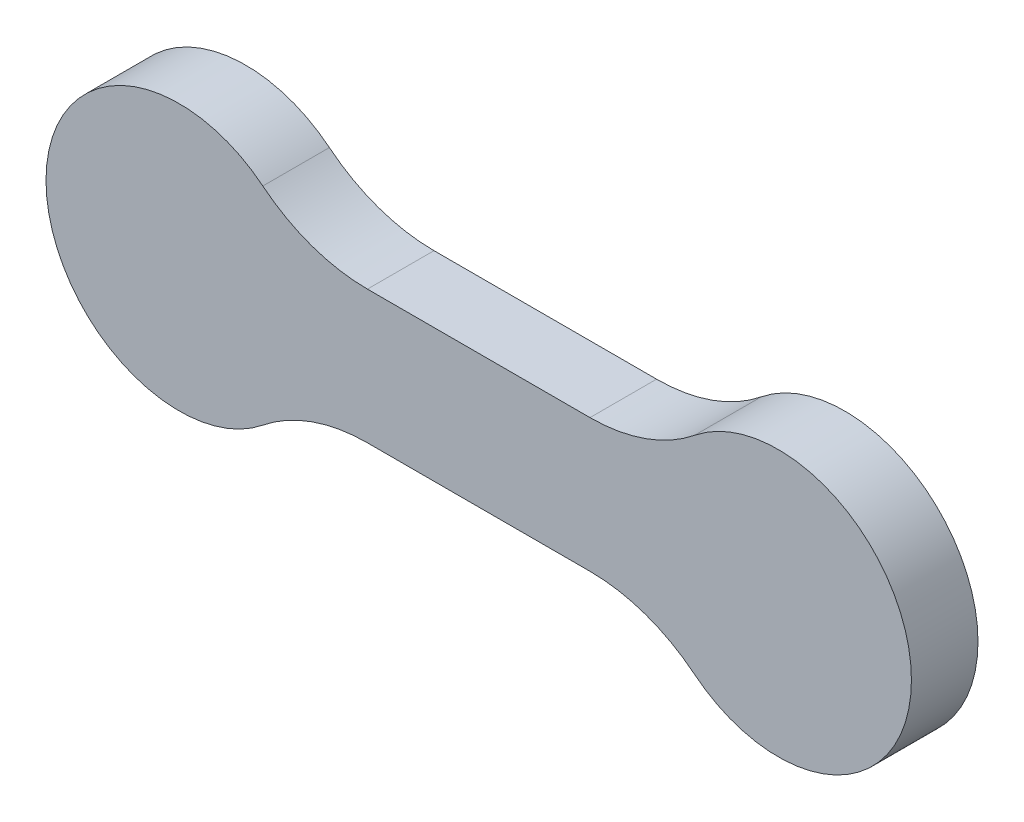
ISO-10303-21;
HEADER;
FILE_DESCRIPTION(('STEP AP214'),'2;1');
FILE_NAME('part.step','',(''),(''),'','','');
FILE_SCHEMA(('AUTOMOTIVE_DESIGN { 1 0 10303 214 1 1 1 1 }'));
ENDSEC;
DATA;
#1=APPLICATION_CONTEXT('core data for automotive mechanical design processes');
#2=APPLICATION_PROTOCOL_DEFINITION('international standard','automotive_design',2000,#1);
#3=PRODUCT_CONTEXT('',#1,'mechanical');
#4=PRODUCT('Part','Part','',(#3));
#5=PRODUCT_RELATED_PRODUCT_CATEGORY('part','',(#4));
#6=PRODUCT_DEFINITION_FORMATION('','',#4);
#7=PRODUCT_DEFINITION_CONTEXT('part definition',#1,'design');
#8=PRODUCT_DEFINITION('design','',#6,#7);
#9=PRODUCT_DEFINITION_SHAPE('','',#8);
#10=(LENGTH_UNIT() NAMED_UNIT(*) SI_UNIT(.MILLI.,.METRE.));
#11=(NAMED_UNIT(*) PLANE_ANGLE_UNIT() SI_UNIT($,.RADIAN.));
#12=(NAMED_UNIT(*) SI_UNIT($,.STERADIAN.) SOLID_ANGLE_UNIT());
#13=UNCERTAINTY_MEASURE_WITH_UNIT(LENGTH_MEASURE(1.E-05),#10,'distance_accuracy_value','');
#14=(GEOMETRIC_REPRESENTATION_CONTEXT(3) GLOBAL_UNCERTAINTY_ASSIGNED_CONTEXT((#13)) GLOBAL_UNIT_ASSIGNED_CONTEXT((#10,
#11,#12)) REPRESENTATION_CONTEXT('',''));
#15=CARTESIAN_POINT('',(0.,0.,0.));
#16=DIRECTION('',(0.,0.,1.));
#17=DIRECTION('',(1.,0.,0.));
#18=AXIS2_PLACEMENT_3D('',#15,#16,#17);
#19=CARTESIAN_POINT('',(123.431457505076,70.,20.));
#20=DIRECTION('',(0.,0.,-1.));
#21=DIRECTION('',(-1.,0.,0.));
#22=AXIS2_PLACEMENT_3D('',#19,#20,#21);
#23=CYLINDRICAL_SURFACE('',#22,50.);
#24=CARTESIAN_POINT('',(123.431457505076,70.,0.));
#25=DIRECTION('',(0.,0.,-1.));
#26=DIRECTION('',(1.,0.,0.));
#27=AXIS2_PLACEMENT_3D('',#24,#25,#26);
#28=CIRCLE('',#27,50.);
#29=CARTESIAN_POINT('',(154.858425557812,31.1111111111111,0.));
#30=VERTEX_POINT('',#29);
#31=CARTESIAN_POINT('',(123.431457505076,20.,0.));
#32=VERTEX_POINT('',#31);
#33=EDGE_CURVE('E135',#30,#32,#28,.T.);
#34=ORIENTED_EDGE('',*,*,#33,.T.);
#35=DIRECTION('',(0.,0.,-1.));
#36=VECTOR('',#35,1.);
#37=CARTESIAN_POINT('',(123.431457505076,20.,20.));
#38=LINE('',#37,#36);
#39=CARTESIAN_POINT('',(123.431457505076,20.,20.));
#40=VERTEX_POINT('',#39);
#41=EDGE_CURVE('E11',#40,#32,#38,.T.);
#42=ORIENTED_EDGE('',*,*,#41,.F.);
#43=CARTESIAN_POINT('',(123.431457505076,70.,20.));
#44=DIRECTION('',(0.,0.,-1.));
#45=DIRECTION('',(1.,0.,0.));
#46=AXIS2_PLACEMENT_3D('',#43,#44,#45);
#47=CIRCLE('',#46,50.);
#48=CARTESIAN_POINT('',(154.858425557812,31.1111111111111,20.));
#49=VERTEX_POINT('',#48);
#50=EDGE_CURVE('E149',#49,#40,#47,.T.);
#51=ORIENTED_EDGE('',*,*,#50,.F.);
#52=DIRECTION('',(0.,0.,-1.));
#53=VECTOR('',#52,1.);
#54=CARTESIAN_POINT('',(154.858425557812,31.1111111111111,20.));
#55=LINE('',#54,#53);
#56=EDGE_CURVE('E131',#49,#30,#55,.T.);
#57=ORIENTED_EDGE('',*,*,#56,.T.);
#58=EDGE_LOOP('',(#34,#42,#51,#57));
#59=FACE_BOUND('',#58,.T.);
#60=ADVANCED_FACE('F39',(#59),#23,.F.);
#61=CARTESIAN_POINT('',(56.5685424949238,20.,20.));
#62=DIRECTION('',(0.,-1.,0.));
#63=DIRECTION('',(0.,0.,-1.));
#64=AXIS2_PLACEMENT_3D('',#61,#62,#63);
#65=PLANE('',#64);
#66=DIRECTION('',(-1.,0.,0.));
#67=VECTOR('',#66,1.);
#68=CARTESIAN_POINT('',(56.5685424949238,20.,0.));
#69=LINE('',#68,#67);
#70=CARTESIAN_POINT('',(56.5685424949238,20.,0.));
#71=VERTEX_POINT('',#70);
#72=EDGE_CURVE('E138',#32,#71,#69,.T.);
#73=ORIENTED_EDGE('',*,*,#72,.T.);
#74=DIRECTION('',(0.,0.,-1.));
#75=VECTOR('',#74,1.);
#76=CARTESIAN_POINT('',(56.5685424949238,20.,20.));
#77=LINE('',#76,#75);
#78=CARTESIAN_POINT('',(56.5685424949238,20.,20.));
#79=VERTEX_POINT('',#78);
#80=EDGE_CURVE('E47',#79,#71,#77,.T.);
#81=ORIENTED_EDGE('',*,*,#80,.F.);
#82=DIRECTION('',(-1.,0.,0.));
#83=VECTOR('',#82,1.);
#84=CARTESIAN_POINT('',(56.5685424949238,20.,20.));
#85=LINE('',#84,#83);
#86=EDGE_CURVE('E98',#40,#79,#85,.T.);
#87=ORIENTED_EDGE('',*,*,#86,.F.);
#88=ORIENTED_EDGE('',*,*,#41,.T.);
#89=EDGE_LOOP('',(#73,#81,#87,#88));
#90=FACE_BOUND('',#89,.T.);
#91=ADVANCED_FACE('F184',(#90),#65,.F.);
#92=CARTESIAN_POINT('',(56.5685424949238,70.,20.));
#93=DIRECTION('',(0.,0.,-1.));
#94=DIRECTION('',(-1.,0.,0.));
#95=AXIS2_PLACEMENT_3D('',#92,#93,#94);
#96=CYLINDRICAL_SURFACE('',#95,50.);
#97=CARTESIAN_POINT('',(56.5685424949238,70.,0.));
#98=DIRECTION('',(0.,0.,-1.));
#99=DIRECTION('',(-1.,0.,0.));
#100=AXIS2_PLACEMENT_3D('',#97,#98,#99);
#101=CIRCLE('',#100,50.);
#102=CARTESIAN_POINT('',(25.1415744421884,31.1111111111111,0.));
#103=VERTEX_POINT('',#102);
#104=EDGE_CURVE('E140',#71,#103,#101,.T.);
#105=ORIENTED_EDGE('',*,*,#104,.T.);
#106=DIRECTION('',(0.,0.,-1.));
#107=VECTOR('',#106,1.);
#108=CARTESIAN_POINT('',(25.1415744421884,31.1111111111111,20.));
#109=LINE('',#108,#107);
#110=CARTESIAN_POINT('',(25.1415744421884,31.1111111111111,20.));
#111=VERTEX_POINT('',#110);
#112=EDGE_CURVE('E156',#111,#103,#109,.T.);
#113=ORIENTED_EDGE('',*,*,#112,.F.);
#114=CARTESIAN_POINT('',(56.5685424949238,70.,20.));
#115=DIRECTION('',(0.,0.,-1.));
#116=DIRECTION('',(-1.,0.,0.));
#117=AXIS2_PLACEMENT_3D('',#114,#115,#116);
#118=CIRCLE('',#117,50.);
#119=EDGE_CURVE('E164',#79,#111,#118,.T.);
#120=ORIENTED_EDGE('',*,*,#119,.F.);
#121=ORIENTED_EDGE('',*,*,#80,.T.);
#122=EDGE_LOOP('',(#105,#113,#120,#121));
#123=FACE_BOUND('',#122,.T.);
#124=ADVANCED_FACE('F162',(#123),#96,.F.);
#125=CARTESIAN_POINT('',(0.,0.,20.));
#126=DIRECTION('',(0.,0.,-1.));
#127=DIRECTION('',(-1.,0.,0.));
#128=AXIS2_PLACEMENT_3D('',#125,#126,#127);
#129=CYLINDRICAL_SURFACE('',#128,40.);
#130=CARTESIAN_POINT('',(0.,0.,0.));
#131=DIRECTION('',(0.,0.,1.));
#132=DIRECTION('',(1.,0.,0.));
#133=AXIS2_PLACEMENT_3D('',#130,#131,#132);
#134=CIRCLE('',#133,40.);
#135=CARTESIAN_POINT('',(25.1415744421883,-31.1111111111111,0.));
#136=VERTEX_POINT('',#135);
#137=EDGE_CURVE('E142',#103,#136,#134,.T.);
#138=ORIENTED_EDGE('',*,*,#137,.T.);
#139=DIRECTION('',(0.,0.,-1.));
#140=VECTOR('',#139,1.);
#141=CARTESIAN_POINT('',(25.1415744421883,-31.1111111111111,20.));
#142=LINE('',#141,#140);
#143=CARTESIAN_POINT('',(25.1415744421883,-31.1111111111111,20.));
#144=VERTEX_POINT('',#143);
#145=EDGE_CURVE('E153',#144,#136,#142,.T.);
#146=ORIENTED_EDGE('',*,*,#145,.F.);
#147=CARTESIAN_POINT('',(0.,0.,20.));
#148=DIRECTION('',(0.,0.,1.));
#149=DIRECTION('',(1.,0.,0.));
#150=AXIS2_PLACEMENT_3D('',#147,#148,#149);
#151=CIRCLE('',#150,40.);
#152=EDGE_CURVE('E176',#111,#144,#151,.T.);
#153=ORIENTED_EDGE('',*,*,#152,.F.);
#154=ORIENTED_EDGE('',*,*,#112,.T.);
#155=EDGE_LOOP('',(#138,#146,#153,#154));
#156=FACE_BOUND('',#155,.T.);
#157=ADVANCED_FACE('F172',(#156),#129,.T.);
#158=CARTESIAN_POINT('',(56.5685424949238,-70.,20.));
#159=DIRECTION('',(0.,0.,-1.));
#160=DIRECTION('',(-1.,0.,0.));
#161=AXIS2_PLACEMENT_3D('',#158,#159,#160);
#162=CYLINDRICAL_SURFACE('',#161,50.);
#163=CARTESIAN_POINT('',(56.5685424949238,-70.,0.));
#164=DIRECTION('',(0.,0.,-1.));
#165=DIRECTION('',(1.,0.,0.));
#166=AXIS2_PLACEMENT_3D('',#163,#164,#165);
#167=CIRCLE('',#166,50.);
#168=CARTESIAN_POINT('',(56.5685424949238,-20.,0.));
#169=VERTEX_POINT('',#168);
#170=EDGE_CURVE('E144',#136,#169,#167,.T.);
#171=ORIENTED_EDGE('',*,*,#170,.T.);
#172=DIRECTION('',(0.,0.,-1.));
#173=VECTOR('',#172,1.);
#174=CARTESIAN_POINT('',(56.5685424949238,-20.,20.));
#175=LINE('',#174,#173);
#176=CARTESIAN_POINT('',(56.5685424949238,-20.,20.));
#177=VERTEX_POINT('',#176);
#178=EDGE_CURVE('E126',#177,#169,#175,.T.);
#179=ORIENTED_EDGE('',*,*,#178,.F.);
#180=CARTESIAN_POINT('',(56.5685424949238,-70.,20.));
#181=DIRECTION('',(0.,0.,-1.));
#182=DIRECTION('',(1.,0.,0.));
#183=AXIS2_PLACEMENT_3D('',#180,#181,#182);
#184=CIRCLE('',#183,50.);
#185=EDGE_CURVE('E117',#144,#177,#184,.T.);
#186=ORIENTED_EDGE('',*,*,#185,.F.);
#187=ORIENTED_EDGE('',*,*,#145,.T.);
#188=EDGE_LOOP('',(#171,#179,#186,#187));
#189=FACE_BOUND('',#188,.T.);
#190=ADVANCED_FACE('F175',(#189),#162,.F.);
#191=CARTESIAN_POINT('',(56.5685424949238,-20.,20.));
#192=DIRECTION('',(0.,1.,0.));
#193=DIRECTION('',(0.,0.,1.));
#194=AXIS2_PLACEMENT_3D('',#191,#192,#193);
#195=PLANE('',#194);
#196=DIRECTION('',(1.,0.,0.));
#197=VECTOR('',#196,1.);
#198=CARTESIAN_POINT('',(56.5685424949238,-20.,0.));
#199=LINE('',#198,#197);
#200=CARTESIAN_POINT('',(123.431457505076,-20.,0.));
#201=VERTEX_POINT('',#200);
#202=EDGE_CURVE('E125',#169,#201,#199,.T.);
#203=ORIENTED_EDGE('',*,*,#202,.T.);
#204=DIRECTION('',(0.,0.,-1.));
#205=VECTOR('',#204,1.);
#206=CARTESIAN_POINT('',(123.431457505076,-20.,20.));
#207=LINE('',#206,#205);
#208=CARTESIAN_POINT('',(123.431457505076,-20.,20.));
#209=VERTEX_POINT('',#208);
#210=EDGE_CURVE('E122',#209,#201,#207,.T.);
#211=ORIENTED_EDGE('',*,*,#210,.F.);
#212=DIRECTION('',(1.,0.,0.));
#213=VECTOR('',#212,1.);
#214=CARTESIAN_POINT('',(56.5685424949238,-20.,20.));
#215=LINE('',#214,#213);
#216=EDGE_CURVE('E111',#177,#209,#215,.T.);
#217=ORIENTED_EDGE('',*,*,#216,.F.);
#218=ORIENTED_EDGE('',*,*,#178,.T.);
#219=EDGE_LOOP('',(#203,#211,#217,#218));
#220=FACE_BOUND('',#219,.T.);
#221=ADVANCED_FACE('F123',(#220),#195,.F.);
#222=CARTESIAN_POINT('',(123.431457505076,-70.,20.));
#223=DIRECTION('',(0.,0.,-1.));
#224=DIRECTION('',(-1.,0.,0.));
#225=AXIS2_PLACEMENT_3D('',#222,#223,#224);
#226=CYLINDRICAL_SURFACE('',#225,50.);
#227=CARTESIAN_POINT('',(123.431457505076,-70.,0.));
#228=DIRECTION('',(0.,0.,-1.));
#229=DIRECTION('',(-1.,0.,0.));
#230=AXIS2_PLACEMENT_3D('',#227,#228,#229);
#231=CIRCLE('',#230,50.);
#232=CARTESIAN_POINT('',(154.858425557812,-31.1111111111111,0.));
#233=VERTEX_POINT('',#232);
#234=EDGE_CURVE('E84',#201,#233,#231,.T.);
#235=ORIENTED_EDGE('',*,*,#234,.T.);
#236=DIRECTION('',(0.,0.,-1.));
#237=VECTOR('',#236,1.);
#238=CARTESIAN_POINT('',(154.858425557812,-31.1111111111111,20.));
#239=LINE('',#238,#237);
#240=CARTESIAN_POINT('',(154.858425557812,-31.1111111111111,20.));
#241=VERTEX_POINT('',#240);
#242=EDGE_CURVE('E127',#241,#233,#239,.T.);
#243=ORIENTED_EDGE('',*,*,#242,.F.);
#244=CARTESIAN_POINT('',(123.431457505076,-70.,20.));
#245=DIRECTION('',(0.,0.,-1.));
#246=DIRECTION('',(-1.,0.,0.));
#247=AXIS2_PLACEMENT_3D('',#244,#245,#246);
#248=CIRCLE('',#247,50.);
#249=EDGE_CURVE('E115',#209,#241,#248,.T.);
#250=ORIENTED_EDGE('',*,*,#249,.F.);
#251=ORIENTED_EDGE('',*,*,#210,.T.);
#252=EDGE_LOOP('',(#235,#243,#250,#251));
#253=FACE_BOUND('',#252,.T.);
#254=ADVANCED_FACE('F129',(#253),#226,.F.);
#255=CARTESIAN_POINT('',(180.,0.,20.));
#256=DIRECTION('',(0.,0.,-1.));
#257=DIRECTION('',(-1.,0.,0.));
#258=AXIS2_PLACEMENT_3D('',#255,#256,#257);
#259=CYLINDRICAL_SURFACE('',#258,40.);
#260=CARTESIAN_POINT('',(180.,0.,0.));
#261=DIRECTION('',(0.,0.,1.));
#262=DIRECTION('',(1.,0.,0.));
#263=AXIS2_PLACEMENT_3D('',#260,#261,#262);
#264=CIRCLE('',#263,40.);
#265=EDGE_CURVE('E90',#233,#30,#264,.T.);
#266=ORIENTED_EDGE('',*,*,#265,.T.);
#267=ORIENTED_EDGE('',*,*,#56,.F.);
#268=CARTESIAN_POINT('',(180.,0.,20.));
#269=DIRECTION('',(0.,0.,1.));
#270=DIRECTION('',(1.,0.,0.));
#271=AXIS2_PLACEMENT_3D('',#268,#269,#270);
#272=CIRCLE('',#271,40.);
#273=EDGE_CURVE('E55',#241,#49,#272,.T.);
#274=ORIENTED_EDGE('',*,*,#273,.F.);
#275=ORIENTED_EDGE('',*,*,#242,.T.);
#276=EDGE_LOOP('',(#266,#267,#274,#275));
#277=FACE_BOUND('',#276,.T.);
#278=ADVANCED_FACE('F200',(#277),#259,.T.);
#279=CARTESIAN_POINT('',(123.431457505076,70.,20.));
#280=DIRECTION('',(0.,0.,1.));
#281=DIRECTION('',(1.,0.,0.));
#282=AXIS2_PLACEMENT_3D('',#279,#280,#281);
#283=PLANE('',#282);
#284=ORIENTED_EDGE('',*,*,#50,.T.);
#285=ORIENTED_EDGE('',*,*,#86,.T.);
#286=ORIENTED_EDGE('',*,*,#119,.T.);
#287=ORIENTED_EDGE('',*,*,#152,.T.);
#288=ORIENTED_EDGE('',*,*,#185,.T.);
#289=ORIENTED_EDGE('',*,*,#216,.T.);
#290=ORIENTED_EDGE('',*,*,#249,.T.);
#291=ORIENTED_EDGE('',*,*,#273,.T.);
#292=EDGE_LOOP('',(#284,#285,#286,#287,#288,#289,#290,#291));
#293=FACE_BOUND('',#292,.T.);
#294=ADVANCED_FACE('F113',(#293),#283,.T.);
#295=CARTESIAN_POINT('',(123.431457505076,70.,0.));
#296=DIRECTION('',(0.,0.,1.));
#297=DIRECTION('',(1.,0.,0.));
#298=AXIS2_PLACEMENT_3D('',#295,#296,#297);
#299=PLANE('',#298);
#300=ORIENTED_EDGE('',*,*,#33,.F.);
#301=ORIENTED_EDGE('',*,*,#265,.F.);
#302=ORIENTED_EDGE('',*,*,#234,.F.);
#303=ORIENTED_EDGE('',*,*,#202,.F.);
#304=ORIENTED_EDGE('',*,*,#170,.F.);
#305=ORIENTED_EDGE('',*,*,#137,.F.);
#306=ORIENTED_EDGE('',*,*,#104,.F.);
#307=ORIENTED_EDGE('',*,*,#72,.F.);
#308=EDGE_LOOP('',(#300,#301,#302,#303,#304,#305,#306,#307));
#309=FACE_BOUND('',#308,.T.);
#310=ADVANCED_FACE('F168',(#309),#299,.F.);
#311=CLOSED_SHELL('',(#60,#91,#124,#157,#190,#221,#254,#278,#294,#310));
#312=MANIFOLD_SOLID_BREP('B2',#311);
#313=ADVANCED_BREP_SHAPE_REPRESENTATION('',(#18,#312),#14);
#314=SHAPE_DEFINITION_REPRESENTATION(#9,#313);
ENDSEC;
END-ISO-10303-21;
